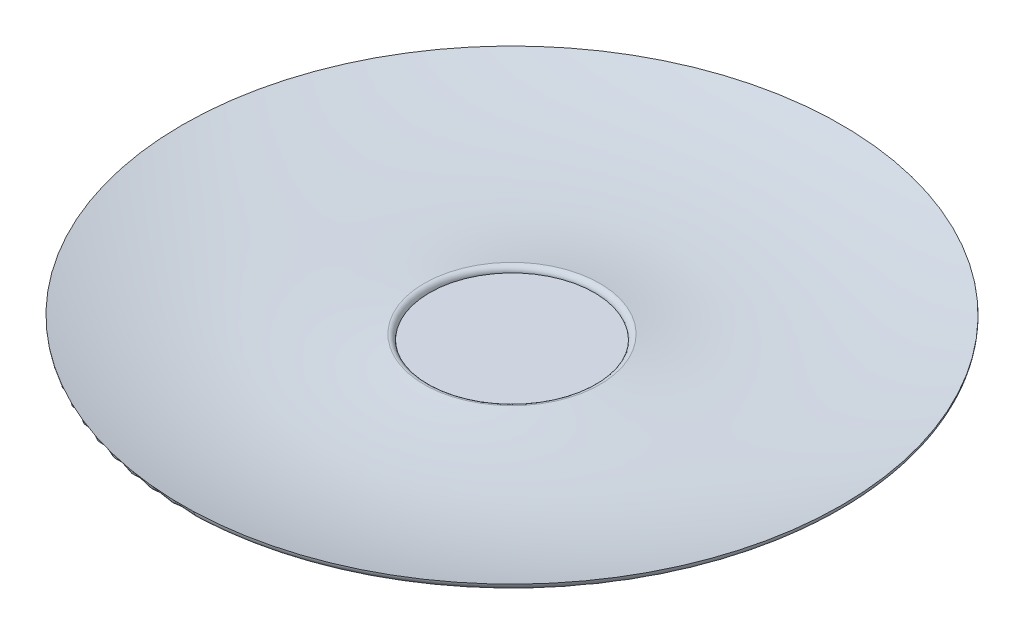
ISO-10303-21;
HEADER;
FILE_DESCRIPTION(('STEP AP214'),'2;1');
FILE_NAME('part.step','',(''),(''),'','','');
FILE_SCHEMA(('AUTOMOTIVE_DESIGN { 1 0 10303 214 1 1 1 1 }'));
ENDSEC;
DATA;
#1=APPLICATION_CONTEXT('core data for automotive mechanical design processes');
#2=APPLICATION_PROTOCOL_DEFINITION('international standard','automotive_design',2000,#1);
#3=PRODUCT_CONTEXT('',#1,'mechanical');
#4=PRODUCT('Part','Part','',(#3));
#5=PRODUCT_RELATED_PRODUCT_CATEGORY('part','',(#4));
#6=PRODUCT_DEFINITION_FORMATION('','',#4);
#7=PRODUCT_DEFINITION_CONTEXT('part definition',#1,'design');
#8=PRODUCT_DEFINITION('design','',#6,#7);
#9=PRODUCT_DEFINITION_SHAPE('','',#8);
#10=(LENGTH_UNIT() NAMED_UNIT(*) SI_UNIT(.MILLI.,.METRE.));
#11=(NAMED_UNIT(*) PLANE_ANGLE_UNIT() SI_UNIT($,.RADIAN.));
#12=(NAMED_UNIT(*) SI_UNIT($,.STERADIAN.) SOLID_ANGLE_UNIT());
#13=UNCERTAINTY_MEASURE_WITH_UNIT(LENGTH_MEASURE(1.E-05),#10,'distance_accuracy_value','');
#14=(GEOMETRIC_REPRESENTATION_CONTEXT(3) GLOBAL_UNCERTAINTY_ASSIGNED_CONTEXT((#13)) GLOBAL_UNIT_ASSIGNED_CONTEXT((#10,
#11,#12)) REPRESENTATION_CONTEXT('',''));
#15=CARTESIAN_POINT('',(0.,0.,0.));
#16=DIRECTION('',(0.,0.,1.));
#17=DIRECTION('',(1.,0.,0.));
#18=AXIS2_PLACEMENT_3D('',#15,#16,#17);
#19=CARTESIAN_POINT('',(0.,-9.71666659489302,0.));
#20=DIRECTION('',(0.,1.,0.));
#21=DIRECTION('',(-1.,0.,0.));
#22=AXIS2_PLACEMENT_3D('',#19,#20,#21);
#23=PLANE('',#22);
#24=CARTESIAN_POINT('',(0.,-9.71666659489302,0.));
#25=DIRECTION('',(0.,1.,0.));
#26=DIRECTION('',(-1.,0.,0.));
#27=AXIS2_PLACEMENT_3D('',#24,#25,#26);
#28=CIRCLE('',#27,16.);
#29=CARTESIAN_POINT('',(-16.,-9.71666659489302,0.));
#30=VERTEX_POINT('',#29);
#31=EDGE_CURVE('E10',#30,#30,#28,.T.);
#32=ORIENTED_EDGE('',*,*,#31,.F.);
#33=EDGE_LOOP('',(#32));
#34=FACE_BOUND('',#33,.T.);
#35=ADVANCED_FACE('F37',(#34),#23,.F.);
#36=CARTESIAN_POINT('',(16.,-9.71666659489301,0.));
#37=CARTESIAN_POINT('',(31.9733990010178,-2.80248133211089,0.));
#38=CARTESIAN_POINT('',(50.081212282711,-7.49710086285231,0.));
#39=CARTESIAN_POINT('',(66.2160175810413,-0.934527379484959,0.));
#40=B_SPLINE_CURVE_WITH_KNOTS('',3,(#36,#37,#38,#39),.UNSPECIFIED.,.F.,.F.,(4,4),(0.,1.),.UNSPECIFIED.);
#41=CARTESIAN_POINT('',(0.,0.,0.));
#42=DIRECTION('',(0.,1.,0.));
#43=AXIS1_PLACEMENT('',#41,#42);
#44=SURFACE_OF_REVOLUTION('',#40,#43);
#45=CARTESIAN_POINT('',(0.,-0.93452737948497,0.));
#46=DIRECTION('',(0.,1.,0.));
#47=DIRECTION('',(-1.,0.,0.));
#48=AXIS2_PLACEMENT_3D('',#45,#46,#47);
#49=CIRCLE('',#48,66.2160175810413);
#50=CARTESIAN_POINT('',(-66.2160175810413,-0.934527379484978,0.));
#51=VERTEX_POINT('',#50);
#52=EDGE_CURVE('E44',#51,#51,#49,.T.);
#53=ORIENTED_EDGE('',*,*,#52,.F.);
#54=EDGE_LOOP('',(#53));
#55=FACE_BOUND('',#54,.T.);
#56=ORIENTED_EDGE('',*,*,#31,.T.);
#57=EDGE_LOOP('',(#56));
#58=FACE_BOUND('',#57,.T.);
#59=ADVANCED_FACE('F92',(#55,#58),#44,.T.);
#60=CARTESIAN_POINT('',(0.,-0.93452737948497,0.));
#61=DIRECTION('',(0.,1.,0.));
#62=DIRECTION('',(-1.,0.,0.));
#63=AXIS2_PLACEMENT_3D('',#60,#61,#62);
#64=CONICAL_SURFACE('',#63,66.2160175810413,1.21611339631366);
#65=CARTESIAN_POINT('',(0.,3.71523571136152,0.));
#66=DIRECTION('',(0.,1.,0.));
#67=DIRECTION('',(-1.,0.,0.));
#68=AXIS2_PLACEMENT_3D('',#65,#66,#67);
#69=CIRCLE('',#68,78.7712538163243);
#70=CARTESIAN_POINT('',(-78.7712538163243,3.71523571136151,0.));
#71=VERTEX_POINT('',#70);
#72=EDGE_CURVE('E49',#71,#71,#69,.T.);
#73=ORIENTED_EDGE('',*,*,#72,.F.);
#74=EDGE_LOOP('',(#73));
#75=FACE_BOUND('',#74,.T.);
#76=ORIENTED_EDGE('',*,*,#52,.T.);
#77=EDGE_LOOP('',(#76));
#78=FACE_BOUND('',#77,.T.);
#79=ADVANCED_FACE('F89',(#75,#78),#64,.T.);
#80=CARTESIAN_POINT('',(0.,5.32968909847483,0.));
#81=DIRECTION('',(0.,1.,0.));
#82=DIRECTION('',(-1.,0.,0.));
#83=AXIS2_PLACEMENT_3D('',#80,#81,#82);
#84=TOROIDAL_SURFACE('',#83,78.3258836823222,1.67475798114911);
#85=CARTESIAN_POINT('',(0.,5.28333340510697,0.));
#86=DIRECTION('',(0.,1.,0.));
#87=DIRECTION('',(-1.,0.,0.));
#88=AXIS2_PLACEMENT_3D('',#85,#86,#87);
#89=CIRCLE('',#88,80.);
#90=CARTESIAN_POINT('',(-80.,5.28333340510696,0.));
#91=VERTEX_POINT('',#90);
#92=EDGE_CURVE('E54',#91,#91,#89,.T.);
#93=ORIENTED_EDGE('',*,*,#92,.F.);
#94=EDGE_LOOP('',(#93));
#95=FACE_BOUND('',#94,.T.);
#96=ORIENTED_EDGE('',*,*,#72,.T.);
#97=EDGE_LOOP('',(#96));
#98=FACE_BOUND('',#97,.T.);
#99=ADVANCED_FACE('F84',(#95,#98),#84,.T.);
#100=CARTESIAN_POINT('',(80.,5.28333340510698,0.));
#101=CARTESIAN_POINT('',(50.5892973258605,-3.64870291836887,0.));
#102=CARTESIAN_POINT('',(21.3071895424837,1.30718954248366,0.));
#103=B_SPLINE_CURVE_WITH_KNOTS('',2,(#100,#101,#102),.UNSPECIFIED.,.F.,.F.,(3,3),(0.,1.),.UNSPECIFIED.);
#104=CARTESIAN_POINT('',(0.,0.,0.));
#105=DIRECTION('',(0.,1.,0.));
#106=AXIS1_PLACEMENT('',#104,#105);
#107=SURFACE_OF_REVOLUTION('',#103,#106);
#108=CARTESIAN_POINT('',(0.,1.30718954248366,0.));
#109=DIRECTION('',(0.,1.,0.));
#110=DIRECTION('',(-1.,0.,0.));
#111=AXIS2_PLACEMENT_3D('',#108,#109,#110);
#112=CIRCLE('',#111,21.3071895424837);
#113=CARTESIAN_POINT('',(-21.3071895424837,1.30718954248365,0.));
#114=VERTEX_POINT('',#113);
#115=EDGE_CURVE('E60',#114,#114,#112,.T.);
#116=ORIENTED_EDGE('',*,*,#115,.F.);
#117=EDGE_LOOP('',(#116));
#118=FACE_BOUND('',#117,.T.);
#119=ORIENTED_EDGE('',*,*,#92,.T.);
#120=EDGE_LOOP('',(#119));
#121=FACE_BOUND('',#120,.T.);
#122=ADVANCED_FACE('F79',(#118,#121),#107,.T.);
#123=CARTESIAN_POINT('',(0.,0.,0.));
#124=DIRECTION('',(0.,1.,0.));
#125=DIRECTION('',(-1.,0.,0.));
#126=AXIS2_PLACEMENT_3D('',#123,#124,#125);
#127=TOROIDAL_SURFACE('',#126,21.3071895424837,1.30718954248366);
#128=CARTESIAN_POINT('',(0.,0.,0.));
#129=DIRECTION('',(0.,1.,0.));
#130=DIRECTION('',(-1.,0.,0.));
#131=AXIS2_PLACEMENT_3D('',#128,#129,#130);
#132=CIRCLE('',#131,20.);
#133=CARTESIAN_POINT('',(-20.,0.,0.));
#134=VERTEX_POINT('',#133);
#135=EDGE_CURVE('E64',#134,#134,#132,.T.);
#136=ORIENTED_EDGE('',*,*,#135,.F.);
#137=EDGE_LOOP('',(#136));
#138=FACE_BOUND('',#137,.T.);
#139=ORIENTED_EDGE('',*,*,#115,.T.);
#140=EDGE_LOOP('',(#139));
#141=FACE_BOUND('',#140,.T.);
#142=ADVANCED_FACE('F83',(#138,#141),#127,.T.);
#143=CARTESIAN_POINT('',(0.,0.,0.));
#144=DIRECTION('',(0.,-1.,0.));
#145=DIRECTION('',(1.,0.,0.));
#146=AXIS2_PLACEMENT_3D('',#143,#144,#145);
#147=PLANE('',#146);
#148=ORIENTED_EDGE('',*,*,#135,.T.);
#149=EDGE_LOOP('',(#148));
#150=FACE_BOUND('',#149,.T.);
#151=ADVANCED_FACE('F133',(#150),#147,.F.);
#152=CLOSED_SHELL('',(#35,#59,#79,#99,#122,#142,#151));
#153=MANIFOLD_SOLID_BREP('B2',#152);
#154=ADVANCED_BREP_SHAPE_REPRESENTATION('',(#18,#153),#14);
#155=SHAPE_DEFINITION_REPRESENTATION(#9,#154);
ENDSEC;
END-ISO-10303-21;
